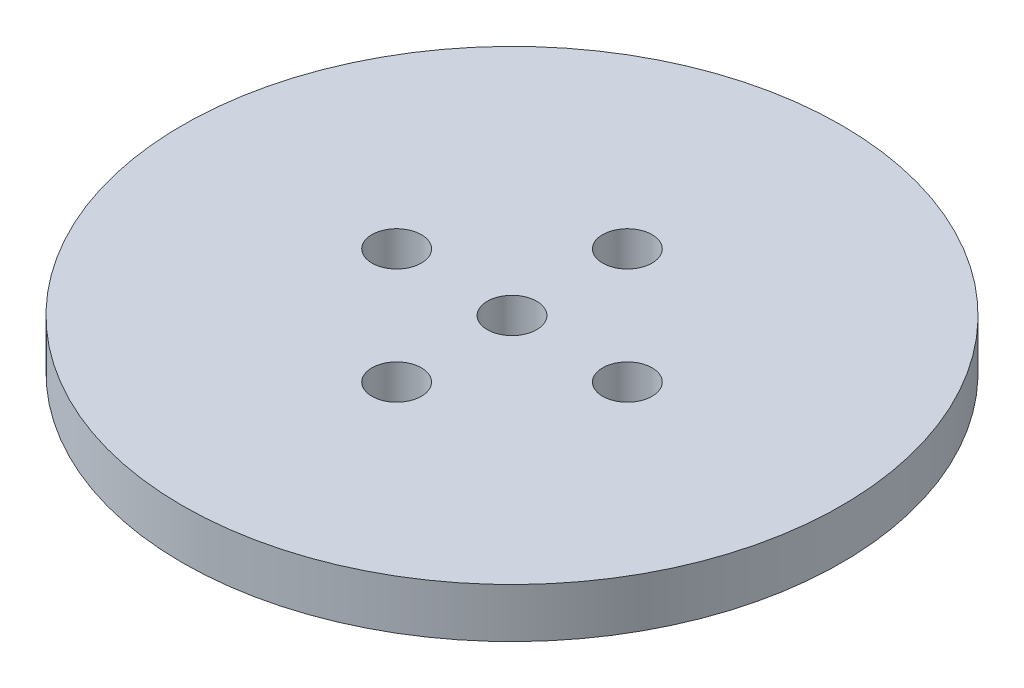
ISO-10303-21;
HEADER;
FILE_DESCRIPTION(('STEP AP214'),'2;1');
FILE_NAME('part.step','',(''),(''),'','','');
FILE_SCHEMA(('AUTOMOTIVE_DESIGN { 1 0 10303 214 1 1 1 1 }'));
ENDSEC;
DATA;
#1=APPLICATION_CONTEXT('core data for automotive mechanical design processes');
#2=APPLICATION_PROTOCOL_DEFINITION('international standard','automotive_design',2000,#1);
#3=PRODUCT_CONTEXT('',#1,'mechanical');
#4=PRODUCT('Part','Part','',(#3));
#5=PRODUCT_RELATED_PRODUCT_CATEGORY('part','',(#4));
#6=PRODUCT_DEFINITION_FORMATION('','',#4);
#7=PRODUCT_DEFINITION_CONTEXT('part definition',#1,'design');
#8=PRODUCT_DEFINITION('design','',#6,#7);
#9=PRODUCT_DEFINITION_SHAPE('','',#8);
#10=(LENGTH_UNIT() NAMED_UNIT(*) SI_UNIT(.MILLI.,.METRE.));
#11=(NAMED_UNIT(*) PLANE_ANGLE_UNIT() SI_UNIT($,.RADIAN.));
#12=(NAMED_UNIT(*) SI_UNIT($,.STERADIAN.) SOLID_ANGLE_UNIT());
#13=UNCERTAINTY_MEASURE_WITH_UNIT(LENGTH_MEASURE(1.E-05),#10,'distance_accuracy_value','');
#14=(GEOMETRIC_REPRESENTATION_CONTEXT(3) GLOBAL_UNCERTAINTY_ASSIGNED_CONTEXT((#13)) GLOBAL_UNIT_ASSIGNED_CONTEXT((#10,
#11,#12)) REPRESENTATION_CONTEXT('',''));
#15=CARTESIAN_POINT('',(0.,0.,0.));
#16=DIRECTION('',(0.,0.,1.));
#17=DIRECTION('',(1.,0.,0.));
#18=AXIS2_PLACEMENT_3D('',#15,#16,#17);
#19=CARTESIAN_POINT('',(0.,3.,0.));
#20=DIRECTION('',(0.,1.,0.));
#21=DIRECTION('',(0.,0.,1.));
#22=AXIS2_PLACEMENT_3D('',#19,#20,#21);
#23=PLANE('',#22);
#24=CARTESIAN_POINT('',(-7.,3.,0.));
#25=DIRECTION('',(0.,1.,0.));
#26=DIRECTION('',(0.,0.,-1.));
#27=AXIS2_PLACEMENT_3D('',#24,#25,#26);
#28=CIRCLE('',#27,1.5);
#29=CARTESIAN_POINT('',(-7.,3.,-1.5));
#30=VERTEX_POINT('',#29);
#31=EDGE_CURVE('E67',#30,#30,#28,.T.);
#32=ORIENTED_EDGE('',*,*,#31,.F.);
#33=EDGE_LOOP('',(#32));
#34=FACE_BOUND('',#33,.T.);
#35=CARTESIAN_POINT('',(0.,3.,0.));
#36=DIRECTION('',(0.,1.,0.));
#37=DIRECTION('',(0.,0.,1.));
#38=AXIS2_PLACEMENT_3D('',#35,#36,#37);
#39=CIRCLE('',#38,1.5);
#40=CARTESIAN_POINT('',(0.,3.,1.5));
#41=VERTEX_POINT('',#40);
#42=EDGE_CURVE('E55',#41,#41,#39,.T.);
#43=ORIENTED_EDGE('',*,*,#42,.F.);
#44=EDGE_LOOP('',(#43));
#45=FACE_BOUND('',#44,.T.);
#46=CARTESIAN_POINT('',(0.,3.,0.));
#47=DIRECTION('',(0.,1.,0.));
#48=DIRECTION('',(0.,0.,1.));
#49=AXIS2_PLACEMENT_3D('',#46,#47,#48);
#50=CIRCLE('',#49,20.);
#51=CARTESIAN_POINT('',(0.,3.,20.));
#52=VERTEX_POINT('',#51);
#53=EDGE_CURVE('E10',#52,#52,#50,.T.);
#54=ORIENTED_EDGE('',*,*,#53,.T.);
#55=EDGE_LOOP('',(#54));
#56=FACE_BOUND('',#55,.T.);
#57=CARTESIAN_POINT('',(0.,3.,-7.));
#58=DIRECTION('',(0.,1.,0.));
#59=DIRECTION('',(0.,0.,1.));
#60=AXIS2_PLACEMENT_3D('',#57,#58,#59);
#61=CIRCLE('',#60,1.5);
#62=CARTESIAN_POINT('',(0.,3.,-5.5));
#63=VERTEX_POINT('',#62);
#64=EDGE_CURVE('E50',#63,#63,#61,.T.);
#65=ORIENTED_EDGE('',*,*,#64,.F.);
#66=EDGE_LOOP('',(#65));
#67=FACE_BOUND('',#66,.T.);
#68=CARTESIAN_POINT('',(7.,3.,0.));
#69=DIRECTION('',(0.,1.,0.));
#70=DIRECTION('',(0.,0.,1.));
#71=AXIS2_PLACEMENT_3D('',#68,#69,#70);
#72=CIRCLE('',#71,1.5);
#73=CARTESIAN_POINT('',(7.,3.,1.5));
#74=VERTEX_POINT('',#73);
#75=EDGE_CURVE('E61',#74,#74,#72,.T.);
#76=ORIENTED_EDGE('',*,*,#75,.F.);
#77=EDGE_LOOP('',(#76));
#78=FACE_BOUND('',#77,.T.);
#79=CARTESIAN_POINT('',(0.,3.,7.));
#80=DIRECTION('',(0.,1.,0.));
#81=DIRECTION('',(0.,0.,-1.));
#82=AXIS2_PLACEMENT_3D('',#79,#80,#81);
#83=CIRCLE('',#82,1.5);
#84=CARTESIAN_POINT('',(0.,3.,5.5));
#85=VERTEX_POINT('',#84);
#86=EDGE_CURVE('E73',#85,#85,#83,.T.);
#87=ORIENTED_EDGE('',*,*,#86,.F.);
#88=EDGE_LOOP('',(#87));
#89=FACE_BOUND('',#88,.T.);
#90=ADVANCED_FACE('F39',(#34,#45,#56,#67,#78,#89),#23,.T.);
#91=CARTESIAN_POINT('',(0.,0.,0.));
#92=DIRECTION('',(0.,1.,0.));
#93=DIRECTION('',(0.,0.,1.));
#94=AXIS2_PLACEMENT_3D('',#91,#92,#93);
#95=PLANE('',#94);
#96=CARTESIAN_POINT('',(0.,0.,0.));
#97=DIRECTION('',(0.,1.,0.));
#98=DIRECTION('',(0.,0.,1.));
#99=AXIS2_PLACEMENT_3D('',#96,#97,#98);
#100=CIRCLE('',#99,20.);
#101=CARTESIAN_POINT('',(0.,0.,20.));
#102=VERTEX_POINT('',#101);
#103=EDGE_CURVE('E43',#102,#102,#100,.T.);
#104=ORIENTED_EDGE('',*,*,#103,.F.);
#105=EDGE_LOOP('',(#104));
#106=FACE_BOUND('',#105,.T.);
#107=CARTESIAN_POINT('',(0.,0.,-7.));
#108=DIRECTION('',(0.,1.,0.));
#109=DIRECTION('',(0.,0.,1.));
#110=AXIS2_PLACEMENT_3D('',#107,#108,#109);
#111=CIRCLE('',#110,1.5);
#112=CARTESIAN_POINT('',(0.,0.,-5.5));
#113=VERTEX_POINT('',#112);
#114=EDGE_CURVE('E52',#113,#113,#111,.T.);
#115=ORIENTED_EDGE('',*,*,#114,.T.);
#116=EDGE_LOOP('',(#115));
#117=FACE_BOUND('',#116,.T.);
#118=CARTESIAN_POINT('',(0.,0.,0.));
#119=DIRECTION('',(0.,1.,0.));
#120=DIRECTION('',(0.,0.,1.));
#121=AXIS2_PLACEMENT_3D('',#118,#119,#120);
#122=CIRCLE('',#121,1.5);
#123=CARTESIAN_POINT('',(0.,0.,1.5));
#124=VERTEX_POINT('',#123);
#125=EDGE_CURVE('E58',#124,#124,#122,.T.);
#126=ORIENTED_EDGE('',*,*,#125,.T.);
#127=EDGE_LOOP('',(#126));
#128=FACE_BOUND('',#127,.T.);
#129=CARTESIAN_POINT('',(7.,0.,0.));
#130=DIRECTION('',(0.,1.,0.));
#131=DIRECTION('',(0.,0.,1.));
#132=AXIS2_PLACEMENT_3D('',#129,#130,#131);
#133=CIRCLE('',#132,1.5);
#134=CARTESIAN_POINT('',(7.,0.,1.5));
#135=VERTEX_POINT('',#134);
#136=EDGE_CURVE('E64',#135,#135,#133,.T.);
#137=ORIENTED_EDGE('',*,*,#136,.T.);
#138=EDGE_LOOP('',(#137));
#139=FACE_BOUND('',#138,.T.);
#140=CARTESIAN_POINT('',(-7.,0.,0.));
#141=DIRECTION('',(0.,1.,0.));
#142=DIRECTION('',(0.,0.,-1.));
#143=AXIS2_PLACEMENT_3D('',#140,#141,#142);
#144=CIRCLE('',#143,1.5);
#145=CARTESIAN_POINT('',(-7.,0.,-1.5));
#146=VERTEX_POINT('',#145);
#147=EDGE_CURVE('E70',#146,#146,#144,.T.);
#148=ORIENTED_EDGE('',*,*,#147,.T.);
#149=EDGE_LOOP('',(#148));
#150=FACE_BOUND('',#149,.T.);
#151=CARTESIAN_POINT('',(0.,0.,7.));
#152=DIRECTION('',(0.,1.,0.));
#153=DIRECTION('',(0.,0.,-1.));
#154=AXIS2_PLACEMENT_3D('',#151,#152,#153);
#155=CIRCLE('',#154,1.5);
#156=CARTESIAN_POINT('',(0.,0.,5.5));
#157=VERTEX_POINT('',#156);
#158=EDGE_CURVE('E76',#157,#157,#155,.T.);
#159=ORIENTED_EDGE('',*,*,#158,.T.);
#160=EDGE_LOOP('',(#159));
#161=FACE_BOUND('',#160,.T.);
#162=ADVANCED_FACE('F86',(#106,#117,#128,#139,#150,#161),#95,.F.);
#163=CARTESIAN_POINT('',(0.,3.,0.));
#164=DIRECTION('',(0.,-1.,0.));
#165=DIRECTION('',(0.,0.,-1.));
#166=AXIS2_PLACEMENT_3D('',#163,#164,#165);
#167=CYLINDRICAL_SURFACE('',#166,20.);
#168=ORIENTED_EDGE('',*,*,#53,.F.);
#169=EDGE_LOOP('',(#168));
#170=FACE_BOUND('',#169,.T.);
#171=ORIENTED_EDGE('',*,*,#103,.T.);
#172=EDGE_LOOP('',(#171));
#173=FACE_BOUND('',#172,.T.);
#174=ADVANCED_FACE('F41',(#170,#173),#167,.T.);
#175=CARTESIAN_POINT('',(0.,3.,-7.));
#176=DIRECTION('',(0.,-1.,0.));
#177=DIRECTION('',(0.,0.,-1.));
#178=AXIS2_PLACEMENT_3D('',#175,#176,#177);
#179=CYLINDRICAL_SURFACE('',#178,1.5);
#180=ORIENTED_EDGE('',*,*,#64,.T.);
#181=EDGE_LOOP('',(#180));
#182=FACE_BOUND('',#181,.T.);
#183=ORIENTED_EDGE('',*,*,#114,.F.);
#184=EDGE_LOOP('',(#183));
#185=FACE_BOUND('',#184,.T.);
#186=ADVANCED_FACE('F96',(#182,#185),#179,.F.);
#187=CARTESIAN_POINT('',(0.,3.,0.));
#188=DIRECTION('',(0.,-1.,0.));
#189=DIRECTION('',(0.,0.,-1.));
#190=AXIS2_PLACEMENT_3D('',#187,#188,#189);
#191=CYLINDRICAL_SURFACE('',#190,1.5);
#192=ORIENTED_EDGE('',*,*,#42,.T.);
#193=EDGE_LOOP('',(#192));
#194=FACE_BOUND('',#193,.T.);
#195=ORIENTED_EDGE('',*,*,#125,.F.);
#196=EDGE_LOOP('',(#195));
#197=FACE_BOUND('',#196,.T.);
#198=ADVANCED_FACE('F99',(#194,#197),#191,.F.);
#199=CARTESIAN_POINT('',(7.,3.,0.));
#200=DIRECTION('',(0.,-1.,0.));
#201=DIRECTION('',(0.,0.,-1.));
#202=AXIS2_PLACEMENT_3D('',#199,#200,#201);
#203=CYLINDRICAL_SURFACE('',#202,1.5);
#204=ORIENTED_EDGE('',*,*,#75,.T.);
#205=EDGE_LOOP('',(#204));
#206=FACE_BOUND('',#205,.T.);
#207=ORIENTED_EDGE('',*,*,#136,.F.);
#208=EDGE_LOOP('',(#207));
#209=FACE_BOUND('',#208,.T.);
#210=ADVANCED_FACE('F103',(#206,#209),#203,.F.);
#211=CARTESIAN_POINT('',(-7.,3.,0.));
#212=DIRECTION('',(0.,-1.,0.));
#213=DIRECTION('',(0.,0.,-1.));
#214=AXIS2_PLACEMENT_3D('',#211,#212,#213);
#215=CYLINDRICAL_SURFACE('',#214,1.5);
#216=ORIENTED_EDGE('',*,*,#31,.T.);
#217=EDGE_LOOP('',(#216));
#218=FACE_BOUND('',#217,.T.);
#219=ORIENTED_EDGE('',*,*,#147,.F.);
#220=EDGE_LOOP('',(#219));
#221=FACE_BOUND('',#220,.T.);
#222=ADVANCED_FACE('F107',(#218,#221),#215,.F.);
#223=CARTESIAN_POINT('',(0.,3.,7.));
#224=DIRECTION('',(0.,-1.,0.));
#225=DIRECTION('',(0.,0.,-1.));
#226=AXIS2_PLACEMENT_3D('',#223,#224,#225);
#227=CYLINDRICAL_SURFACE('',#226,1.5);
#228=ORIENTED_EDGE('',*,*,#86,.T.);
#229=EDGE_LOOP('',(#228));
#230=FACE_BOUND('',#229,.T.);
#231=ORIENTED_EDGE('',*,*,#158,.F.);
#232=EDGE_LOOP('',(#231));
#233=FACE_BOUND('',#232,.T.);
#234=ADVANCED_FACE('F82',(#230,#233),#227,.F.);
#235=CLOSED_SHELL('',(#90,#162,#174,#186,#198,#210,#222,#234));
#236=MANIFOLD_SOLID_BREP('B2',#235);
#237=ADVANCED_BREP_SHAPE_REPRESENTATION('',(#18,#236),#14);
#238=SHAPE_DEFINITION_REPRESENTATION(#9,#237);
ENDSEC;
END-ISO-10303-21;
